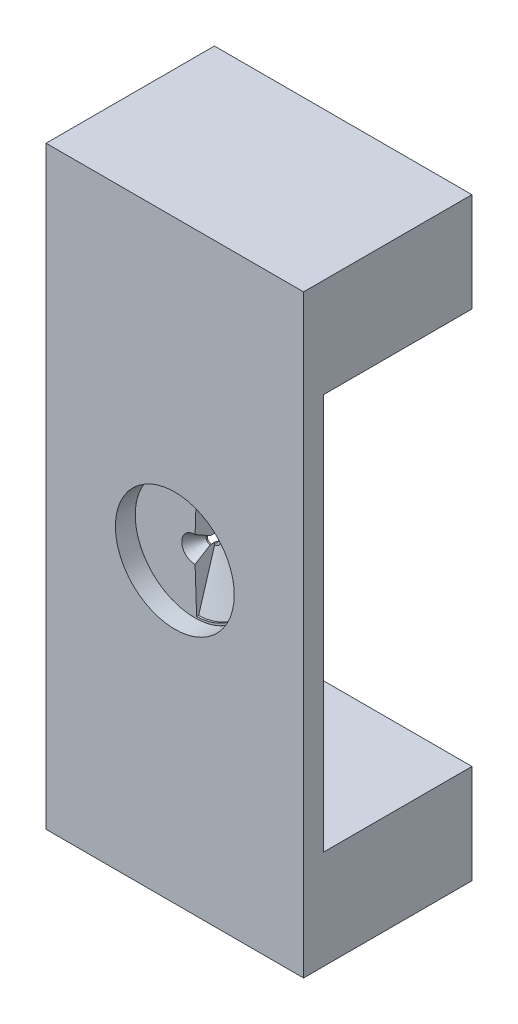
ISO-10303-21;
HEADER;
FILE_DESCRIPTION(('STEP AP214'),'2;1');
FILE_NAME('part.step','',(''),(''),'','','');
FILE_SCHEMA(('AUTOMOTIVE_DESIGN { 1 0 10303 214 1 1 1 1 }'));
ENDSEC;
DATA;
#1=APPLICATION_CONTEXT('core data for automotive mechanical design processes');
#2=APPLICATION_PROTOCOL_DEFINITION('international standard','automotive_design',2000,#1);
#3=PRODUCT_CONTEXT('',#1,'mechanical');
#4=PRODUCT('Part','Part','',(#3));
#5=PRODUCT_RELATED_PRODUCT_CATEGORY('part','',(#4));
#6=PRODUCT_DEFINITION_FORMATION('','',#4);
#7=PRODUCT_DEFINITION_CONTEXT('part definition',#1,'design');
#8=PRODUCT_DEFINITION('design','',#6,#7);
#9=PRODUCT_DEFINITION_SHAPE('','',#8);
#10=(LENGTH_UNIT() NAMED_UNIT(*) SI_UNIT(.MILLI.,.METRE.));
#11=(NAMED_UNIT(*) PLANE_ANGLE_UNIT() SI_UNIT($,.RADIAN.));
#12=(NAMED_UNIT(*) SI_UNIT($,.STERADIAN.) SOLID_ANGLE_UNIT());
#13=UNCERTAINTY_MEASURE_WITH_UNIT(LENGTH_MEASURE(1.E-05),#10,'distance_accuracy_value','');
#14=(GEOMETRIC_REPRESENTATION_CONTEXT(3) GLOBAL_UNCERTAINTY_ASSIGNED_CONTEXT((#13)) GLOBAL_UNIT_ASSIGNED_CONTEXT((#10,
#11,#12)) REPRESENTATION_CONTEXT('',''));
#15=CARTESIAN_POINT('',(0.,0.,0.));
#16=DIRECTION('',(0.,0.,1.));
#17=DIRECTION('',(1.,0.,0.));
#18=AXIS2_PLACEMENT_3D('',#15,#16,#17);
#19=CARTESIAN_POINT('',(0.,0.,0.));
#20=DIRECTION('',(0.,0.,-1.));
#21=DIRECTION('',(-1.,0.,0.));
#22=AXIS2_PLACEMENT_3D('',#19,#20,#21);
#23=PLANE('',#22);
#24=CARTESIAN_POINT('',(0.,0.,0.));
#25=DIRECTION('',(0.,0.,-1.));
#26=DIRECTION('',(-1.,0.,0.));
#27=AXIS2_PLACEMENT_3D('',#24,#25,#26);
#28=CIRCLE('',#27,6.);
#29=CARTESIAN_POINT('',(-6.,0.,0.));
#30=VERTEX_POINT('',#29);
#31=EDGE_CURVE('E153',#30,#30,#28,.T.);
#32=ORIENTED_EDGE('',*,*,#31,.F.);
#33=EDGE_LOOP('',(#32));
#34=FACE_BOUND('',#33,.T.);
#35=DIRECTION('',(0.0348994967024975,-0.999390827019096,0.));
#36=VECTOR('',#35,1.);
#37=CARTESIAN_POINT('',(0.,0.,0.));
#38=LINE('',#37,#36);
#39=CARTESIAN_POINT('',(0.0453693457131359,-1.29920807512483,0.));
#40=VERTEX_POINT('',#39);
#41=CARTESIAN_POINT('',(0.202417080874374,-5.79646679671074,0.));
#42=VERTEX_POINT('',#41);
#43=EDGE_CURVE('E143',#40,#42,#38,.T.);
#44=ORIENTED_EDGE('',*,*,#43,.F.);
#45=CARTESIAN_POINT('',(0.,0.,0.));
#46=DIRECTION('',(0.,0.,-1.));
#47=DIRECTION('',(-1.,0.,0.));
#48=AXIS2_PLACEMENT_3D('',#45,#46,#47);
#49=CIRCLE('',#48,1.3);
#50=CARTESIAN_POINT('',(0.0453693457132468,1.29920807512482,0.));
#51=VERTEX_POINT('',#50);
#52=EDGE_CURVE('E133',#40,#51,#49,.T.);
#53=ORIENTED_EDGE('',*,*,#52,.T.);
#54=DIRECTION('',(0.0348994967024975,0.999390827019096,0.));
#55=VECTOR('',#54,1.);
#56=CARTESIAN_POINT('',(0.,0.,0.));
#57=LINE('',#56,#55);
#58=CARTESIAN_POINT('',(0.202417080874485,5.79646679671074,0.));
#59=VERTEX_POINT('',#58);
#60=EDGE_CURVE('E141',#51,#59,#57,.T.);
#61=ORIENTED_EDGE('',*,*,#60,.T.);
#62=CARTESIAN_POINT('',(0.,0.,0.));
#63=DIRECTION('',(0.,0.,-1.));
#64=DIRECTION('',(-1.,0.,0.));
#65=AXIS2_PLACEMENT_3D('',#62,#63,#64);
#66=CIRCLE('',#65,5.79999999999998);
#67=EDGE_CURVE('E149',#59,#42,#66,.T.);
#68=ORIENTED_EDGE('',*,*,#67,.T.);
#69=EDGE_LOOP('',(#44,#53,#61,#68));
#70=FACE_BOUND('',#69,.T.);
#71=ADVANCED_FACE('F44',(#34,#70),#23,.F.);
#72=CARTESIAN_POINT('',(0.,0.,-2.2));
#73=DIRECTION('',(0.,0.,1.));
#74=DIRECTION('',(1.,0.,0.));
#75=AXIS2_PLACEMENT_3D('',#72,#73,#74);
#76=CYLINDRICAL_SURFACE('',#75,6.);
#77=ORIENTED_EDGE('',*,*,#31,.T.);
#78=EDGE_LOOP('',(#77));
#79=FACE_BOUND('',#78,.T.);
#80=CARTESIAN_POINT('',(0.,0.,-0.2));
#81=DIRECTION('',(0.,0.,1.));
#82=DIRECTION('',(1.,0.,0.));
#83=AXIS2_PLACEMENT_3D('',#80,#81,#82);
#84=CIRCLE('',#83,6.);
#85=CARTESIAN_POINT('',(0.,-6.,-0.199999999999923));
#86=VERTEX_POINT('',#85);
#87=CARTESIAN_POINT('',(0.,6.,-0.2));
#88=VERTEX_POINT('',#87);
#89=EDGE_CURVE('E218',#86,#88,#84,.T.);
#90=ORIENTED_EDGE('',*,*,#89,.T.);
#91=CARTESIAN_POINT('',(0.,0.,-0.2));
#92=DIRECTION('',(0.,0.,1.));
#93=DIRECTION('',(1.,0.,0.));
#94=AXIS2_PLACEMENT_3D('',#91,#92,#93);
#95=CIRCLE('',#94,6.);
#96=EDGE_CURVE('E150',#88,#86,#95,.T.);
#97=ORIENTED_EDGE('',*,*,#96,.T.);
#98=EDGE_LOOP('',(#90,#97));
#99=FACE_BOUND('',#98,.T.);
#100=ADVANCED_FACE('F46',(#79,#99),#76,.T.);
#101=CARTESIAN_POINT('',(0.,0.,-2.2));
#102=DIRECTION('',(0.,0.,-1.));
#103=DIRECTION('',(-1.,0.,0.));
#104=AXIS2_PLACEMENT_3D('',#101,#102,#103);
#105=PLANE('',#104);
#106=CARTESIAN_POINT('',(0.,0.,-2.2));
#107=DIRECTION('',(0.,0.,-1.));
#108=DIRECTION('',(-1.,0.,0.));
#109=AXIS2_PLACEMENT_3D('',#106,#107,#108);
#110=CIRCLE('',#109,0.4);
#111=CARTESIAN_POINT('',(0.,0.4,-2.2));
#112=VERTEX_POINT('',#111);
#113=CARTESIAN_POINT('',(0.,-0.4,-2.19999999999999));
#114=VERTEX_POINT('',#113);
#115=EDGE_CURVE('E66',#112,#114,#110,.T.);
#116=ORIENTED_EDGE('',*,*,#115,.F.);
#117=DIRECTION('',(0.,-1.,0.));
#118=VECTOR('',#117,1.);
#119=CARTESIAN_POINT('',(0.,0.,-2.2));
#120=LINE('',#119,#118);
#121=CARTESIAN_POINT('',(0.,0.5,-2.20000000000001));
#122=VERTEX_POINT('',#121);
#123=EDGE_CURVE('E193',#122,#112,#120,.T.);
#124=ORIENTED_EDGE('',*,*,#123,.F.);
#125=CARTESIAN_POINT('',(0.,0.,-2.2));
#126=DIRECTION('',(0.,0.,1.));
#127=DIRECTION('',(1.,0.,0.));
#128=AXIS2_PLACEMENT_3D('',#125,#126,#127);
#129=CIRCLE('',#128,0.5);
#130=CARTESIAN_POINT('',(0.,-0.5,-2.19999999999999));
#131=VERTEX_POINT('',#130);
#132=EDGE_CURVE('E215',#131,#122,#129,.T.);
#133=ORIENTED_EDGE('',*,*,#132,.F.);
#134=EDGE_CURVE('E191',#114,#131,#120,.T.);
#135=ORIENTED_EDGE('',*,*,#134,.F.);
#136=EDGE_LOOP('',(#116,#124,#133,#135));
#137=FACE_BOUND('',#136,.T.);
#138=ADVANCED_FACE('F229',(#137),#105,.T.);
#139=CARTESIAN_POINT('',(-6.,-6.,-0.2));
#140=DIRECTION('',(0.,0.,1.));
#141=DIRECTION('',(1.,0.,0.));
#142=AXIS2_PLACEMENT_3D('',#139,#140,#141);
#143=PLANE('',#142);
#144=DIRECTION('',(0.,1.,0.));
#145=VECTOR('',#144,1.);
#146=CARTESIAN_POINT('',(0.,0.,-0.2));
#147=LINE('',#146,#145);
#148=CARTESIAN_POINT('',(0.,1.4,-0.199999999999982));
#149=VERTEX_POINT('',#148);
#150=EDGE_CURVE('E185',#149,#88,#147,.T.);
#151=ORIENTED_EDGE('',*,*,#150,.F.);
#152=CARTESIAN_POINT('',(0.,0.,-0.199999999999982));
#153=DIRECTION('',(0.,0.,-1.));
#154=DIRECTION('',(-1.,0.,0.));
#155=AXIS2_PLACEMENT_3D('',#152,#153,#154);
#156=CIRCLE('',#155,1.4);
#157=CARTESIAN_POINT('',(0.,-1.4,-0.199999999999982));
#158=VERTEX_POINT('',#157);
#159=EDGE_CURVE('E207',#158,#149,#156,.T.);
#160=ORIENTED_EDGE('',*,*,#159,.F.);
#161=DIRECTION('',(0.,-1.,0.));
#162=VECTOR('',#161,1.);
#163=CARTESIAN_POINT('',(0.,0.,-0.2));
#164=LINE('',#163,#162);
#165=EDGE_CURVE('E194',#158,#86,#164,.T.);
#166=ORIENTED_EDGE('',*,*,#165,.T.);
#167=ORIENTED_EDGE('',*,*,#96,.F.);
#168=EDGE_LOOP('',(#151,#160,#166,#167));
#169=FACE_BOUND('',#168,.T.);
#170=ADVANCED_FACE('F233',(#169),#143,.F.);
#171=CARTESIAN_POINT('',(0.,0.,-2.2));
#172=DIRECTION('',(0.,0.,1.));
#173=DIRECTION('',(1.,0.,0.));
#174=AXIS2_PLACEMENT_3D('',#171,#172,#173);
#175=CONICAL_SURFACE('',#174,0.5,1.22202532321099);
#176=ORIENTED_EDGE('',*,*,#89,.F.);
#177=DIRECTION('',(0.,-0.939793423488437,0.341743063086704));
#178=VECTOR('',#177,1.);
#179=CARTESIAN_POINT('',(0.,-6.,-0.2));
#180=LINE('',#179,#178);
#181=EDGE_CURVE('E212',#131,#86,#180,.T.);
#182=ORIENTED_EDGE('',*,*,#181,.F.);
#183=ORIENTED_EDGE('',*,*,#132,.T.);
#184=DIRECTION('',(0.,0.939793423488437,0.341743063086704));
#185=VECTOR('',#184,1.);
#186=CARTESIAN_POINT('',(0.,6.,-0.2));
#187=LINE('',#186,#185);
#188=EDGE_CURVE('E209',#122,#88,#187,.T.);
#189=ORIENTED_EDGE('',*,*,#188,.T.);
#190=EDGE_LOOP('',(#176,#182,#183,#189));
#191=FACE_BOUND('',#190,.T.);
#192=ADVANCED_FACE('F237',(#191),#175,.T.);
#193=CARTESIAN_POINT('',(0.,0.,-1.7));
#194=DIRECTION('',(0.,0.,1.));
#195=DIRECTION('',(1.,0.,0.));
#196=AXIS2_PLACEMENT_3D('',#193,#194,#195);
#197=PLANE('',#196);
#198=DIRECTION('',(0.,1.,0.));
#199=VECTOR('',#198,1.);
#200=CARTESIAN_POINT('',(0.,0.,-1.7));
#201=LINE('',#200,#199);
#202=CARTESIAN_POINT('',(0.,0.4,-1.7));
#203=VERTEX_POINT('',#202);
#204=CARTESIAN_POINT('',(0.,0.468510194017478,-1.69999999999999));
#205=VERTEX_POINT('',#204);
#206=EDGE_CURVE('E200',#203,#205,#201,.T.);
#207=ORIENTED_EDGE('',*,*,#206,.F.);
#208=CARTESIAN_POINT('',(0.,0.,-1.7));
#209=DIRECTION('',(0.,0.,1.));
#210=DIRECTION('',(1.,0.,0.));
#211=AXIS2_PLACEMENT_3D('',#208,#209,#210);
#212=CIRCLE('',#211,0.4);
#213=CARTESIAN_POINT('',(0.,-0.4,-1.7));
#214=VERTEX_POINT('',#213);
#215=EDGE_CURVE('E383',#203,#214,#212,.T.);
#216=ORIENTED_EDGE('',*,*,#215,.T.);
#217=CARTESIAN_POINT('',(0.,-0.468510194017478,-1.69999999999999));
#218=VERTEX_POINT('',#217);
#219=EDGE_CURVE('E201',#218,#214,#201,.T.);
#220=ORIENTED_EDGE('',*,*,#219,.F.);
#221=CARTESIAN_POINT('',(0.,0.,-1.69999999999999));
#222=DIRECTION('',(0.,0.,-1.));
#223=DIRECTION('',(-1.,0.,0.));
#224=AXIS2_PLACEMENT_3D('',#221,#222,#223);
#225=CIRCLE('',#224,0.468510194017478);
#226=EDGE_CURVE('E204',#218,#205,#225,.T.);
#227=ORIENTED_EDGE('',*,*,#226,.T.);
#228=EDGE_LOOP('',(#207,#216,#220,#227));
#229=FACE_BOUND('',#228,.T.);
#230=ADVANCED_FACE('F241',(#229),#197,.F.);
#231=CARTESIAN_POINT('',(0.,0.,0.));
#232=DIRECTION('',(-1.,0.,0.));
#233=DIRECTION('',(0.,0.,1.));
#234=AXIS2_PLACEMENT_3D('',#231,#232,#233);
#235=PLANE('',#234);
#236=DIRECTION('',(0.,0.,-1.));
#237=VECTOR('',#236,1.);
#238=CARTESIAN_POINT('',(0.,0.4,-1.5));
#239=LINE('',#238,#237);
#240=EDGE_CURVE('E395',#203,#112,#239,.T.);
#241=ORIENTED_EDGE('',*,*,#240,.F.);
#242=ORIENTED_EDGE('',*,*,#206,.T.);
#243=DIRECTION('',(0.,-0.527549004063797,-0.84952460135731));
#244=VECTOR('',#243,1.);
#245=CARTESIAN_POINT('',(0.,1.10000203911056,-0.683093790660977));
#246=LINE('',#245,#244);
#247=EDGE_CURVE('E188',#149,#205,#246,.T.);
#248=ORIENTED_EDGE('',*,*,#247,.F.);
#249=ORIENTED_EDGE('',*,*,#150,.T.);
#250=ORIENTED_EDGE('',*,*,#188,.F.);
#251=ORIENTED_EDGE('',*,*,#123,.T.);
#252=EDGE_LOOP('',(#241,#242,#248,#249,#250,#251));
#253=FACE_BOUND('',#252,.T.);
#254=ADVANCED_FACE('F251',(#253),#235,.T.);
#255=DIRECTION('',(0.,0.,-1.));
#256=VECTOR('',#255,1.);
#257=CARTESIAN_POINT('',(0.,-0.4,-1.5));
#258=LINE('',#257,#256);
#259=EDGE_CURVE('E378',#114,#214,#258,.F.);
#260=ORIENTED_EDGE('',*,*,#259,.F.);
#261=ORIENTED_EDGE('',*,*,#134,.T.);
#262=ORIENTED_EDGE('',*,*,#181,.T.);
#263=ORIENTED_EDGE('',*,*,#165,.F.);
#264=DIRECTION('',(0.,0.527549004063797,-0.84952460135731));
#265=VECTOR('',#264,1.);
#266=CARTESIAN_POINT('',(0.,-1.10000203911056,-0.683093790660977));
#267=LINE('',#266,#265);
#268=EDGE_CURVE('E197',#158,#218,#267,.T.);
#269=ORIENTED_EDGE('',*,*,#268,.T.);
#270=ORIENTED_EDGE('',*,*,#219,.T.);
#271=EDGE_LOOP('',(#260,#261,#262,#263,#269,#270));
#272=FACE_BOUND('',#271,.T.);
#273=ADVANCED_FACE('F247',(#272),#235,.T.);
#274=CARTESIAN_POINT('',(0.,0.,-0.199999999999982));
#275=DIRECTION('',(0.,0.,1.));
#276=DIRECTION('',(1.,0.,0.));
#277=AXIS2_PLACEMENT_3D('',#274,#275,#276);
#278=CONICAL_SURFACE('',#277,1.4,0.555712833834986);
#279=ORIENTED_EDGE('',*,*,#226,.F.);
#280=ORIENTED_EDGE('',*,*,#268,.F.);
#281=ORIENTED_EDGE('',*,*,#159,.T.);
#282=ORIENTED_EDGE('',*,*,#247,.T.);
#283=EDGE_LOOP('',(#279,#280,#281,#282));
#284=FACE_BOUND('',#283,.T.);
#285=ADVANCED_FACE('F243',(#284),#278,.T.);
#286=CARTESIAN_POINT('',(0.,0.,-2.20000000000001));
#287=DIRECTION('',(0.,0.,1.));
#288=DIRECTION('',(1.,0.,0.));
#289=AXIS2_PLACEMENT_3D('',#286,#287,#288);
#290=CYLINDRICAL_SURFACE('',#289,5.79999999999998);
#291=DIRECTION('',(0.,0.,-1.));
#292=VECTOR('',#291,1.);
#293=CARTESIAN_POINT('',(0.202417080874478,5.79646679671074,0.43493987426225));
#294=LINE('',#293,#292);
#295=CARTESIAN_POINT('',(0.202417080874488,5.79646679671073,-0.200000000000012));
#296=VERTEX_POINT('',#295);
#297=EDGE_CURVE('E147',#59,#296,#294,.T.);
#298=ORIENTED_EDGE('',*,*,#297,.T.);
#299=CARTESIAN_POINT('',(0.,0.,-0.200000000000015));
#300=DIRECTION('',(0.,0.,1.));
#301=DIRECTION('',(1.,0.,0.));
#302=AXIS2_PLACEMENT_3D('',#299,#300,#301);
#303=CIRCLE('',#302,5.79999999999998);
#304=CARTESIAN_POINT('',(0.202417080874377,-5.79646679671074,-0.200000000000012));
#305=VERTEX_POINT('',#304);
#306=EDGE_CURVE('E177',#305,#296,#303,.T.);
#307=ORIENTED_EDGE('',*,*,#306,.F.);
#308=DIRECTION('',(0.,0.,-1.));
#309=VECTOR('',#308,1.);
#310=CARTESIAN_POINT('',(0.202417080874368,-5.79646679671075,0.43493987426225));
#311=LINE('',#310,#309);
#312=EDGE_CURVE('E179',#42,#305,#311,.T.);
#313=ORIENTED_EDGE('',*,*,#312,.F.);
#314=ORIENTED_EDGE('',*,*,#67,.F.);
#315=EDGE_LOOP('',(#298,#307,#313,#314));
#316=FACE_BOUND('',#315,.T.);
#317=ADVANCED_FACE('F246',(#316),#290,.F.);
#318=CARTESIAN_POINT('',(-1.10858314770395E-13,0.,0.));
#319=DIRECTION('',(0.999390827019096,0.0348994967024975,0.));
#320=DIRECTION('',(0.,0.,1.));
#321=AXIS2_PLACEMENT_3D('',#318,#319,#320);
#322=PLANE('',#321);
#323=DIRECTION('',(-0.0173667175456884,0.497317722331631,-0.867394650765479));
#324=VECTOR('',#323,1.);
#325=CARTESIAN_POINT('',(0.,0.,-2.26600839662639));
#326=LINE('',#325,#324);
#327=CARTESIAN_POINT('',(0.0139597986809119,-0.399756330807641,-1.56877504381827));
#328=VERTEX_POINT('',#327);
#329=EDGE_CURVE('E59',#40,#328,#326,.T.);
#330=ORIENTED_EDGE('',*,*,#329,.F.);
#331=ORIENTED_EDGE('',*,*,#43,.T.);
#332=ORIENTED_EDGE('',*,*,#312,.T.);
#333=DIRECTION('',(-0.0329644167202757,0.943977386525636,-0.328359621388686));
#334=VECTOR('',#333,1.);
#335=CARTESIAN_POINT('',(0.202417080874377,-5.79646679671074,-0.200000000000012));
#336=LINE('',#335,#334);
#337=CARTESIAN_POINT('',(0.0217129192434347,-0.62177665496882,-2.00000000000001));
#338=VERTEX_POINT('',#337);
#339=EDGE_CURVE('E174',#305,#338,#336,.T.);
#340=ORIENTED_EDGE('',*,*,#339,.T.);
#341=DIRECTION('',(-0.0348994967024975,0.999390827019096,0.));
#342=VECTOR('',#341,1.);
#343=CARTESIAN_POINT('',(0.0217129192434347,-0.62177665496882,-2.00000000000001));
#344=LINE('',#343,#342);
#345=CARTESIAN_POINT('',(0.0139597986809198,-0.399756330807641,-2.00000000000001));
#346=VERTEX_POINT('',#345);
#347=EDGE_CURVE('E164',#338,#346,#344,.T.);
#348=ORIENTED_EDGE('',*,*,#347,.T.);
#349=DIRECTION('',(0.,0.,-1.));
#350=VECTOR('',#349,1.);
#351=CARTESIAN_POINT('',(0.0139597986809119,-0.399756330807641,-1.5));
#352=LINE('',#351,#350);
#353=EDGE_CURVE('E172',#328,#346,#352,.T.);
#354=ORIENTED_EDGE('',*,*,#353,.F.);
#355=EDGE_LOOP('',(#330,#331,#332,#340,#348,#354));
#356=FACE_BOUND('',#355,.T.);
#357=ADVANCED_FACE('F171',(#356),#322,.T.);
#358=CARTESIAN_POINT('',(0.,0.,0.));
#359=DIRECTION('',(-0.999390827019096,0.0348994967024975,0.));
#360=DIRECTION('',(0.,0.,1.));
#361=AXIS2_PLACEMENT_3D('',#358,#359,#360);
#362=PLANE('',#361);
#363=ORIENTED_EDGE('',*,*,#60,.F.);
#364=DIRECTION('',(-0.0173667175456884,-0.497317722331631,-0.867394650765479));
#365=VECTOR('',#364,1.);
#366=CARTESIAN_POINT('',(0.,0.,-2.26600839662639));
#367=LINE('',#366,#365);
#368=CARTESIAN_POINT('',(0.0139597986810265,0.39975633080763,-1.56877504381829));
#369=VERTEX_POINT('',#368);
#370=EDGE_CURVE('E130',#51,#369,#367,.T.);
#371=ORIENTED_EDGE('',*,*,#370,.T.);
#372=DIRECTION('',(0.,0.,-1.));
#373=VECTOR('',#372,1.);
#374=CARTESIAN_POINT('',(0.0139597986810228,0.399756330807638,-1.5));
#375=LINE('',#374,#373);
#376=CARTESIAN_POINT('',(0.0139597986810307,0.399756330807637,-2.00000000000001));
#377=VERTEX_POINT('',#376);
#378=EDGE_CURVE('E406',#369,#377,#375,.T.);
#379=ORIENTED_EDGE('',*,*,#378,.T.);
#380=DIRECTION('',(-0.0348994967024975,-0.999390827019096,0.));
#381=VECTOR('',#380,1.);
#382=CARTESIAN_POINT('',(0.0217129192435456,0.621776654968816,-2.00000000000001));
#383=LINE('',#382,#381);
#384=CARTESIAN_POINT('',(0.0217129192435456,0.621776654968816,-2.00000000000001));
#385=VERTEX_POINT('',#384);
#386=EDGE_CURVE('E166',#385,#377,#383,.T.);
#387=ORIENTED_EDGE('',*,*,#386,.F.);
#388=DIRECTION('',(-0.0329644167202757,-0.943977386525636,-0.328359621388686));
#389=VECTOR('',#388,1.);
#390=CARTESIAN_POINT('',(0.202417080874488,5.79646679671073,-0.200000000000012));
#391=LINE('',#390,#389);
#392=EDGE_CURVE('E401',#296,#385,#391,.T.);
#393=ORIENTED_EDGE('',*,*,#392,.F.);
#394=ORIENTED_EDGE('',*,*,#297,.F.);
#395=EDGE_LOOP('',(#363,#371,#379,#387,#393,#394));
#396=FACE_BOUND('',#395,.T.);
#397=ADVANCED_FACE('F145',(#396),#362,.F.);
#398=CARTESIAN_POINT('',(0.,0.,-0.200000000000015));
#399=DIRECTION('',(0.,0.,1.));
#400=DIRECTION('',(1.,0.,0.));
#401=AXIS2_PLACEMENT_3D('',#398,#399,#400);
#402=CONICAL_SURFACE('',#401,5.79999999999998,1.23622994932621);
#403=CARTESIAN_POINT('',(0.,0.,-2.00000000000001));
#404=DIRECTION('',(0.,0.,1.));
#405=DIRECTION('',(1.,0.,0.));
#406=AXIS2_PLACEMENT_3D('',#403,#404,#405);
#407=CIRCLE('',#406,0.622155655383994);
#408=EDGE_CURVE('E175',#338,#385,#407,.T.);
#409=ORIENTED_EDGE('',*,*,#408,.F.);
#410=ORIENTED_EDGE('',*,*,#339,.F.);
#411=ORIENTED_EDGE('',*,*,#306,.T.);
#412=ORIENTED_EDGE('',*,*,#392,.T.);
#413=EDGE_LOOP('',(#409,#410,#411,#412));
#414=FACE_BOUND('',#413,.T.);
#415=ADVANCED_FACE('F256',(#414),#402,.F.);
#416=CARTESIAN_POINT('',(0.0217129192434347,-0.62177665496882,-2.00000000000001));
#417=DIRECTION('',(0.,0.,-1.));
#418=DIRECTION('',(-1.,0.,0.));
#419=AXIS2_PLACEMENT_3D('',#416,#417,#418);
#420=PLANE('',#419);
#421=ORIENTED_EDGE('',*,*,#386,.T.);
#422=CARTESIAN_POINT('',(0.,0.,-2.00000000000001));
#423=DIRECTION('',(0.,0.,-1.));
#424=DIRECTION('',(-1.,0.,0.));
#425=AXIS2_PLACEMENT_3D('',#422,#423,#424);
#426=CIRCLE('',#425,0.4);
#427=EDGE_CURVE('E52',#377,#346,#426,.T.);
#428=ORIENTED_EDGE('',*,*,#427,.T.);
#429=ORIENTED_EDGE('',*,*,#347,.F.);
#430=ORIENTED_EDGE('',*,*,#408,.T.);
#431=EDGE_LOOP('',(#421,#428,#429,#430));
#432=FACE_BOUND('',#431,.T.);
#433=ADVANCED_FACE('F163',(#432),#420,.F.);
#434=CARTESIAN_POINT('',(0.,0.,-1.5));
#435=DIRECTION('',(0.,0.,-1.));
#436=DIRECTION('',(-1.,0.,0.));
#437=AXIS2_PLACEMENT_3D('',#434,#435,#436);
#438=CYLINDRICAL_SURFACE('',#437,0.4);
#439=ORIENTED_EDGE('',*,*,#240,.T.);
#440=ORIENTED_EDGE('',*,*,#115,.T.);
#441=ORIENTED_EDGE('',*,*,#259,.T.);
#442=ORIENTED_EDGE('',*,*,#215,.F.);
#443=EDGE_LOOP('',(#439,#440,#441,#442));
#444=FACE_BOUND('',#443,.T.);
#445=ORIENTED_EDGE('',*,*,#378,.F.);
#446=CARTESIAN_POINT('',(0.,0.,-1.56877504381827));
#447=DIRECTION('',(0.,0.,1.));
#448=DIRECTION('',(1.,0.,0.));
#449=AXIS2_PLACEMENT_3D('',#446,#447,#448);
#450=CIRCLE('',#449,0.4);
#451=EDGE_CURVE('E12',#369,#328,#450,.T.);
#452=ORIENTED_EDGE('',*,*,#451,.T.);
#453=ORIENTED_EDGE('',*,*,#353,.T.);
#454=ORIENTED_EDGE('',*,*,#427,.F.);
#455=EDGE_LOOP('',(#445,#452,#453,#454));
#456=FACE_BOUND('',#455,.T.);
#457=ADVANCED_FACE('F262',(#444,#456),#438,.F.);
#458=CARTESIAN_POINT('',(0.,0.,-1.56877504381829));
#459=DIRECTION('',(0.,0.,1.));
#460=DIRECTION('',(1.,0.,0.));
#461=AXIS2_PLACEMENT_3D('',#458,#459,#460);
#462=CONICAL_SURFACE('',#461,0.399999999999993,0.520853752560354);
#463=ORIENTED_EDGE('',*,*,#329,.T.);
#464=ORIENTED_EDGE('',*,*,#451,.F.);
#465=ORIENTED_EDGE('',*,*,#370,.F.);
#466=ORIENTED_EDGE('',*,*,#52,.F.);
#467=EDGE_LOOP('',(#463,#464,#465,#466));
#468=FACE_BOUND('',#467,.T.);
#469=ADVANCED_FACE('F132',(#468),#462,.F.);
#470=CLOSED_SHELL('',(#71,#100,#138,#170,#192,#230,#254,#273,#285,#317,#357,#397,#415,#433,#457,#469));
#471=MANIFOLD_SOLID_BREP('B2',#470);
#472=CARTESIAN_POINT('',(0.,0.,0.));
#473=DIRECTION('',(0.,0.,1.));
#474=DIRECTION('',(1.,0.,0.));
#475=AXIS2_PLACEMENT_3D('',#472,#473,#474);
#476=PLANE('',#475);
#477=CARTESIAN_POINT('',(0.,0.,0.));
#478=DIRECTION('',(0.,0.,1.));
#479=DIRECTION('',(1.,0.,0.));
#480=AXIS2_PLACEMENT_3D('',#477,#478,#479);
#481=CIRCLE('',#480,6.);
#482=CARTESIAN_POINT('',(6.,0.,0.));
#483=VERTEX_POINT('',#482);
#484=EDGE_CURVE('E415',#483,#483,#481,.T.);
#485=ORIENTED_EDGE('',*,*,#484,.T.);
#486=EDGE_LOOP('',(#485));
#487=FACE_BOUND('',#486,.T.);
#488=DIRECTION('',(1.,0.,0.));
#489=VECTOR('',#488,1.);
#490=CARTESIAN_POINT('',(-13.,-20.,0.));
#491=LINE('',#490,#489);
#492=CARTESIAN_POINT('',(-13.,-20.,0.));
#493=VERTEX_POINT('',#492);
#494=CARTESIAN_POINT('',(13.,-20.,0.));
#495=VERTEX_POINT('',#494);
#496=EDGE_CURVE('E498',#493,#495,#491,.T.);
#497=ORIENTED_EDGE('',*,*,#496,.F.);
#498=DIRECTION('',(0.,1.,0.));
#499=VECTOR('',#498,1.);
#500=CARTESIAN_POINT('',(-13.,0.,0.));
#501=LINE('',#500,#499);
#502=CARTESIAN_POINT('',(-13.,20.,0.));
#503=VERTEX_POINT('',#502);
#504=EDGE_CURVE('E503',#493,#503,#501,.T.);
#505=ORIENTED_EDGE('',*,*,#504,.T.);
#506=DIRECTION('',(-1.,0.,0.));
#507=VECTOR('',#506,1.);
#508=CARTESIAN_POINT('',(-13.,20.,0.));
#509=LINE('',#508,#507);
#510=CARTESIAN_POINT('',(13.,20.,0.));
#511=VERTEX_POINT('',#510);
#512=EDGE_CURVE('E426',#511,#503,#509,.T.);
#513=ORIENTED_EDGE('',*,*,#512,.F.);
#514=DIRECTION('',(0.,-1.,0.));
#515=VECTOR('',#514,1.);
#516=CARTESIAN_POINT('',(13.,0.,0.));
#517=LINE('',#516,#515);
#518=EDGE_CURVE('E542',#511,#495,#517,.T.);
#519=ORIENTED_EDGE('',*,*,#518,.T.);
#520=EDGE_LOOP('',(#497,#505,#513,#519));
#521=FACE_BOUND('',#520,.T.);
#522=ADVANCED_FACE('F412',(#487,#521),#476,.F.);
#523=CARTESIAN_POINT('',(0.,0.,2.));
#524=DIRECTION('',(0.,0.,1.));
#525=DIRECTION('',(1.,0.,0.));
#526=AXIS2_PLACEMENT_3D('',#523,#524,#525);
#527=PLANE('',#526);
#528=DIRECTION('',(0.,1.,0.));
#529=VECTOR('',#528,1.);
#530=CARTESIAN_POINT('',(-13.,0.,2.));
#531=LINE('',#530,#529);
#532=CARTESIAN_POINT('',(-13.,-30.,2.));
#533=VERTEX_POINT('',#532);
#534=CARTESIAN_POINT('',(-13.,30.,2.));
#535=VERTEX_POINT('',#534);
#536=EDGE_CURVE('E540',#533,#535,#531,.T.);
#537=ORIENTED_EDGE('',*,*,#536,.F.);
#538=DIRECTION('',(-1.,0.,0.));
#539=VECTOR('',#538,1.);
#540=CARTESIAN_POINT('',(13.,-30.,2.));
#541=LINE('',#540,#539);
#542=CARTESIAN_POINT('',(13.,-30.,2.));
#543=VERTEX_POINT('',#542);
#544=EDGE_CURVE('E528',#543,#533,#541,.T.);
#545=ORIENTED_EDGE('',*,*,#544,.F.);
#546=DIRECTION('',(0.,-1.,0.));
#547=VECTOR('',#546,1.);
#548=CARTESIAN_POINT('',(13.,0.,2.));
#549=LINE('',#548,#547);
#550=CARTESIAN_POINT('',(13.,30.,2.));
#551=VERTEX_POINT('',#550);
#552=EDGE_CURVE('E434',#551,#543,#549,.T.);
#553=ORIENTED_EDGE('',*,*,#552,.F.);
#554=DIRECTION('',(1.,0.,0.));
#555=VECTOR('',#554,1.);
#556=CARTESIAN_POINT('',(-13.,30.,2.));
#557=LINE('',#556,#555);
#558=EDGE_CURVE('E538',#535,#551,#557,.T.);
#559=ORIENTED_EDGE('',*,*,#558,.F.);
#560=EDGE_LOOP('',(#537,#545,#553,#559));
#561=FACE_BOUND('',#560,.T.);
#562=CARTESIAN_POINT('',(0.,0.,2.));
#563=DIRECTION('',(0.,0.,1.));
#564=DIRECTION('',(1.,0.,0.));
#565=AXIS2_PLACEMENT_3D('',#562,#563,#564);
#566=CIRCLE('',#565,6.);
#567=CARTESIAN_POINT('',(6.,0.,2.));
#568=VERTEX_POINT('',#567);
#569=EDGE_CURVE('E42',#568,#568,#566,.T.);
#570=ORIENTED_EDGE('',*,*,#569,.F.);
#571=EDGE_LOOP('',(#570));
#572=FACE_BOUND('',#571,.T.);
#573=ADVANCED_FACE('F552',(#561,#572),#527,.T.);
#574=CARTESIAN_POINT('',(0.,0.,2.));
#575=DIRECTION('',(0.,0.,-1.));
#576=DIRECTION('',(-1.,0.,0.));
#577=AXIS2_PLACEMENT_3D('',#574,#575,#576);
#578=CYLINDRICAL_SURFACE('',#577,6.);
#579=ORIENTED_EDGE('',*,*,#569,.T.);
#580=EDGE_LOOP('',(#579));
#581=FACE_BOUND('',#580,.T.);
#582=ORIENTED_EDGE('',*,*,#484,.F.);
#583=EDGE_LOOP('',(#582));
#584=FACE_BOUND('',#583,.T.);
#585=ADVANCED_FACE('F549',(#581,#584),#578,.F.);
#586=CARTESIAN_POINT('',(13.,0.,-8.));
#587=DIRECTION('',(-1.,0.,0.));
#588=DIRECTION('',(0.,0.,1.));
#589=AXIS2_PLACEMENT_3D('',#586,#587,#588);
#590=PLANE('',#589);
#591=ORIENTED_EDGE('',*,*,#518,.F.);
#592=DIRECTION('',(0.,0.,1.));
#593=VECTOR('',#592,1.);
#594=CARTESIAN_POINT('',(13.,20.,-15.));
#595=LINE('',#594,#593);
#596=CARTESIAN_POINT('',(13.,20.,-15.));
#597=VERTEX_POINT('',#596);
#598=EDGE_CURVE('E522',#597,#511,#595,.T.);
#599=ORIENTED_EDGE('',*,*,#598,.F.);
#600=DIRECTION('',(0.,-1.,0.));
#601=VECTOR('',#600,1.);
#602=CARTESIAN_POINT('',(13.,20.,-15.));
#603=LINE('',#602,#601);
#604=CARTESIAN_POINT('',(13.,30.,-15.));
#605=VERTEX_POINT('',#604);
#606=EDGE_CURVE('E505',#605,#597,#603,.T.);
#607=ORIENTED_EDGE('',*,*,#606,.F.);
#608=DIRECTION('',(0.,0.,-1.));
#609=VECTOR('',#608,1.);
#610=CARTESIAN_POINT('',(13.,30.,2.));
#611=LINE('',#610,#609);
#612=EDGE_CURVE('E533',#551,#605,#611,.T.);
#613=ORIENTED_EDGE('',*,*,#612,.F.);
#614=ORIENTED_EDGE('',*,*,#552,.T.);
#615=DIRECTION('',(0.,0.,1.));
#616=VECTOR('',#615,1.);
#617=CARTESIAN_POINT('',(13.,-30.,0.));
#618=LINE('',#617,#616);
#619=CARTESIAN_POINT('',(13.,-30.,-15.));
#620=VERTEX_POINT('',#619);
#621=EDGE_CURVE('E525',#620,#543,#618,.T.);
#622=ORIENTED_EDGE('',*,*,#621,.F.);
#623=DIRECTION('',(0.,-1.,0.));
#624=VECTOR('',#623,1.);
#625=CARTESIAN_POINT('',(13.,-20.,-15.));
#626=LINE('',#625,#624);
#627=CARTESIAN_POINT('',(13.,-20.,-15.));
#628=VERTEX_POINT('',#627);
#629=EDGE_CURVE('E488',#628,#620,#626,.T.);
#630=ORIENTED_EDGE('',*,*,#629,.F.);
#631=DIRECTION('',(0.,0.,1.));
#632=VECTOR('',#631,1.);
#633=CARTESIAN_POINT('',(13.,-20.,-15.));
#634=LINE('',#633,#632);
#635=EDGE_CURVE('E484',#628,#495,#634,.T.);
#636=ORIENTED_EDGE('',*,*,#635,.T.);
#637=EDGE_LOOP('',(#591,#599,#607,#613,#614,#622,#630,#636));
#638=FACE_BOUND('',#637,.T.);
#639=ADVANCED_FACE('F551',(#638),#590,.F.);
#640=CARTESIAN_POINT('',(-13.,0.,-8.));
#641=DIRECTION('',(1.,0.,0.));
#642=DIRECTION('',(0.,0.,-1.));
#643=AXIS2_PLACEMENT_3D('',#640,#641,#642);
#644=PLANE('',#643);
#645=ORIENTED_EDGE('',*,*,#504,.F.);
#646=DIRECTION('',(0.,0.,1.));
#647=VECTOR('',#646,1.);
#648=CARTESIAN_POINT('',(-13.,-20.,-15.));
#649=LINE('',#648,#647);
#650=CARTESIAN_POINT('',(-13.,-20.,-15.));
#651=VERTEX_POINT('',#650);
#652=EDGE_CURVE('E481',#651,#493,#649,.T.);
#653=ORIENTED_EDGE('',*,*,#652,.F.);
#654=DIRECTION('',(0.,1.,0.));
#655=VECTOR('',#654,1.);
#656=CARTESIAN_POINT('',(-13.,-30.,-15.));
#657=LINE('',#656,#655);
#658=CARTESIAN_POINT('',(-13.,-30.,-15.));
#659=VERTEX_POINT('',#658);
#660=EDGE_CURVE('E489',#659,#651,#657,.T.);
#661=ORIENTED_EDGE('',*,*,#660,.F.);
#662=DIRECTION('',(0.,0.,-1.));
#663=VECTOR('',#662,1.);
#664=CARTESIAN_POINT('',(-13.,-30.,2.));
#665=LINE('',#664,#663);
#666=EDGE_CURVE('E531',#533,#659,#665,.T.);
#667=ORIENTED_EDGE('',*,*,#666,.F.);
#668=ORIENTED_EDGE('',*,*,#536,.T.);
#669=DIRECTION('',(0.,0.,1.));
#670=VECTOR('',#669,1.);
#671=CARTESIAN_POINT('',(-13.,30.,0.));
#672=LINE('',#671,#670);
#673=CARTESIAN_POINT('',(-13.,30.,-15.));
#674=VERTEX_POINT('',#673);
#675=EDGE_CURVE('E535',#674,#535,#672,.T.);
#676=ORIENTED_EDGE('',*,*,#675,.F.);
#677=DIRECTION('',(0.,1.,0.));
#678=VECTOR('',#677,1.);
#679=CARTESIAN_POINT('',(-13.,30.,-15.));
#680=LINE('',#679,#678);
#681=CARTESIAN_POINT('',(-13.,20.,-15.));
#682=VERTEX_POINT('',#681);
#683=EDGE_CURVE('E514',#682,#674,#680,.T.);
#684=ORIENTED_EDGE('',*,*,#683,.F.);
#685=DIRECTION('',(0.,0.,1.));
#686=VECTOR('',#685,1.);
#687=CARTESIAN_POINT('',(-13.,20.,-15.));
#688=LINE('',#687,#686);
#689=EDGE_CURVE('E519',#682,#503,#688,.T.);
#690=ORIENTED_EDGE('',*,*,#689,.T.);
#691=EDGE_LOOP('',(#645,#653,#661,#667,#668,#676,#684,#690));
#692=FACE_BOUND('',#691,.T.);
#693=ADVANCED_FACE('F501',(#692),#644,.F.);
#694=CARTESIAN_POINT('',(0.,30.,0.));
#695=DIRECTION('',(0.,1.,0.));
#696=DIRECTION('',(-1.,0.,0.));
#697=AXIS2_PLACEMENT_3D('',#694,#695,#696);
#698=PLANE('',#697);
#699=ORIENTED_EDGE('',*,*,#612,.T.);
#700=DIRECTION('',(1.,0.,0.));
#701=VECTOR('',#700,1.);
#702=CARTESIAN_POINT('',(13.,30.,-15.));
#703=LINE('',#702,#701);
#704=EDGE_CURVE('E517',#674,#605,#703,.T.);
#705=ORIENTED_EDGE('',*,*,#704,.F.);
#706=ORIENTED_EDGE('',*,*,#675,.T.);
#707=ORIENTED_EDGE('',*,*,#558,.T.);
#708=EDGE_LOOP('',(#699,#705,#706,#707));
#709=FACE_BOUND('',#708,.T.);
#710=ADVANCED_FACE('F594',(#709),#698,.T.);
#711=CARTESIAN_POINT('',(0.,-30.,0.));
#712=DIRECTION('',(0.,-1.,0.));
#713=DIRECTION('',(1.,0.,0.));
#714=AXIS2_PLACEMENT_3D('',#711,#712,#713);
#715=PLANE('',#714);
#716=ORIENTED_EDGE('',*,*,#621,.T.);
#717=ORIENTED_EDGE('',*,*,#544,.T.);
#718=ORIENTED_EDGE('',*,*,#666,.T.);
#719=DIRECTION('',(-1.,0.,0.));
#720=VECTOR('',#719,1.);
#721=CARTESIAN_POINT('',(13.,-30.,-15.));
#722=LINE('',#721,#720);
#723=EDGE_CURVE('E495',#620,#659,#722,.T.);
#724=ORIENTED_EDGE('',*,*,#723,.F.);
#725=EDGE_LOOP('',(#716,#717,#718,#724));
#726=FACE_BOUND('',#725,.T.);
#727=ADVANCED_FACE('F609',(#726),#715,.T.);
#728=CARTESIAN_POINT('',(-13.,20.,-15.));
#729=DIRECTION('',(0.,1.,0.));
#730=DIRECTION('',(-1.,0.,0.));
#731=AXIS2_PLACEMENT_3D('',#728,#729,#730);
#732=PLANE('',#731);
#733=ORIENTED_EDGE('',*,*,#512,.T.);
#734=ORIENTED_EDGE('',*,*,#689,.F.);
#735=DIRECTION('',(-1.,0.,0.));
#736=VECTOR('',#735,1.);
#737=CARTESIAN_POINT('',(-13.,20.,-15.));
#738=LINE('',#737,#736);
#739=EDGE_CURVE('E512',#597,#682,#738,.T.);
#740=ORIENTED_EDGE('',*,*,#739,.F.);
#741=ORIENTED_EDGE('',*,*,#598,.T.);
#742=EDGE_LOOP('',(#733,#734,#740,#741));
#743=FACE_BOUND('',#742,.T.);
#744=ADVANCED_FACE('F626',(#743),#732,.F.);
#745=CARTESIAN_POINT('',(0.,0.,-15.));
#746=DIRECTION('',(0.,0.,1.));
#747=DIRECTION('',(1.,0.,0.));
#748=AXIS2_PLACEMENT_3D('',#745,#746,#747);
#749=PLANE('',#748);
#750=ORIENTED_EDGE('',*,*,#606,.T.);
#751=ORIENTED_EDGE('',*,*,#739,.T.);
#752=ORIENTED_EDGE('',*,*,#683,.T.);
#753=ORIENTED_EDGE('',*,*,#704,.T.);
#754=EDGE_LOOP('',(#750,#751,#752,#753));
#755=FACE_BOUND('',#754,.T.);
#756=ADVANCED_FACE('F638',(#755),#749,.F.);
#757=CARTESIAN_POINT('',(-13.,-20.,-15.));
#758=DIRECTION('',(0.,-1.,0.));
#759=DIRECTION('',(1.,0.,0.));
#760=AXIS2_PLACEMENT_3D('',#757,#758,#759);
#761=PLANE('',#760);
#762=ORIENTED_EDGE('',*,*,#496,.T.);
#763=ORIENTED_EDGE('',*,*,#635,.F.);
#764=DIRECTION('',(1.,0.,0.));
#765=VECTOR('',#764,1.);
#766=CARTESIAN_POINT('',(-13.,-20.,-15.));
#767=LINE('',#766,#765);
#768=EDGE_CURVE('E477',#651,#628,#767,.T.);
#769=ORIENTED_EDGE('',*,*,#768,.F.);
#770=ORIENTED_EDGE('',*,*,#652,.T.);
#771=EDGE_LOOP('',(#762,#763,#769,#770));
#772=FACE_BOUND('',#771,.T.);
#773=ADVANCED_FACE('F479',(#772),#761,.F.);
#774=CARTESIAN_POINT('',(0.,0.,-15.));
#775=DIRECTION('',(0.,0.,-1.));
#776=DIRECTION('',(-1.,0.,0.));
#777=AXIS2_PLACEMENT_3D('',#774,#775,#776);
#778=PLANE('',#777);
#779=ORIENTED_EDGE('',*,*,#660,.T.);
#780=ORIENTED_EDGE('',*,*,#768,.T.);
#781=ORIENTED_EDGE('',*,*,#629,.T.);
#782=ORIENTED_EDGE('',*,*,#723,.T.);
#783=EDGE_LOOP('',(#779,#780,#781,#782));
#784=FACE_BOUND('',#783,.T.);
#785=ADVANCED_FACE('F493',(#784),#778,.T.);
#786=CLOSED_SHELL('',(#522,#573,#585,#639,#693,#710,#727,#744,#756,#773,#785));
#787=MANIFOLD_SOLID_BREP('B6',#786);
#788=ADVANCED_BREP_SHAPE_REPRESENTATION('',(#18,#471,#787),#14);
#789=SHAPE_DEFINITION_REPRESENTATION(#9,#788);
ENDSEC;
END-ISO-10303-21;
